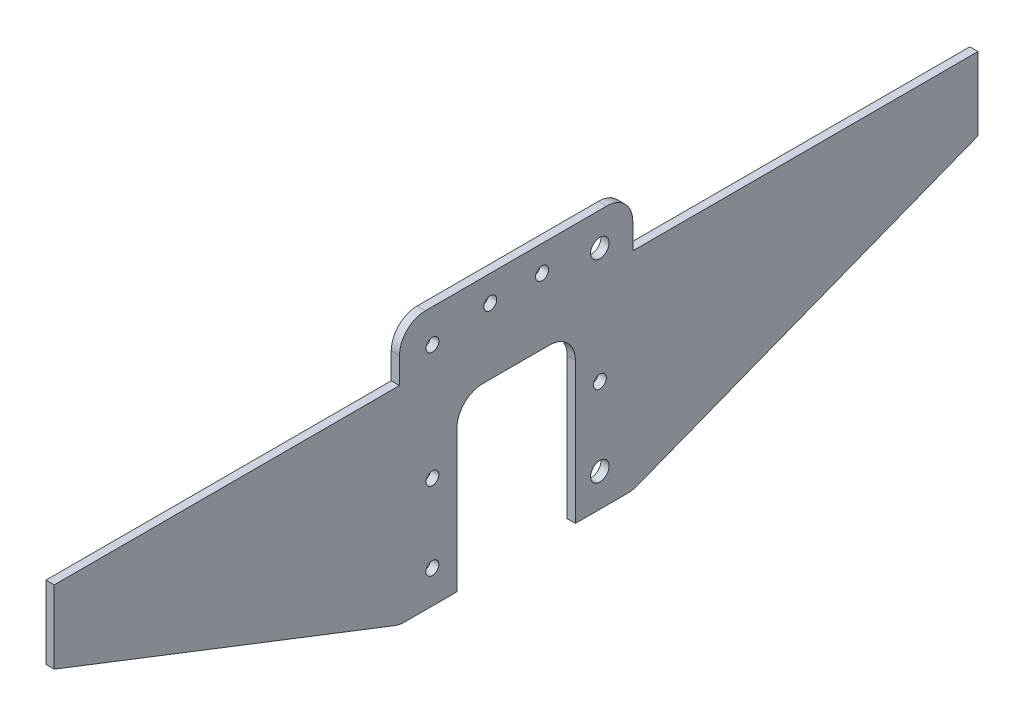
ISO-10303-21;
HEADER;
FILE_DESCRIPTION(('STEP AP214'),'2;1');
FILE_NAME('part.step','',(''),(''),'','','');
FILE_SCHEMA(('AUTOMOTIVE_DESIGN { 1 0 10303 214 1 1 1 1 }'));
ENDSEC;
DATA;
#1=APPLICATION_CONTEXT('core data for automotive mechanical design processes');
#2=APPLICATION_PROTOCOL_DEFINITION('international standard','automotive_design',2000,#1);
#3=PRODUCT_CONTEXT('',#1,'mechanical');
#4=PRODUCT('Part','Part','',(#3));
#5=PRODUCT_RELATED_PRODUCT_CATEGORY('part','',(#4));
#6=PRODUCT_DEFINITION_FORMATION('','',#4);
#7=PRODUCT_DEFINITION_CONTEXT('part definition',#1,'design');
#8=PRODUCT_DEFINITION('design','',#6,#7);
#9=PRODUCT_DEFINITION_SHAPE('','',#8);
#10=(LENGTH_UNIT() NAMED_UNIT(*) SI_UNIT(.MILLI.,.METRE.));
#11=(NAMED_UNIT(*) PLANE_ANGLE_UNIT() SI_UNIT($,.RADIAN.));
#12=(NAMED_UNIT(*) SI_UNIT($,.STERADIAN.) SOLID_ANGLE_UNIT());
#13=UNCERTAINTY_MEASURE_WITH_UNIT(LENGTH_MEASURE(1.E-05),#10,'distance_accuracy_value','');
#14=(GEOMETRIC_REPRESENTATION_CONTEXT(3) GLOBAL_UNCERTAINTY_ASSIGNED_CONTEXT((#13)) GLOBAL_UNIT_ASSIGNED_CONTEXT((#10,
#11,#12)) REPRESENTATION_CONTEXT('',''));
#15=CARTESIAN_POINT('',(0.,0.,0.));
#16=DIRECTION('',(0.,0.,1.));
#17=DIRECTION('',(1.,0.,0.));
#18=AXIS2_PLACEMENT_3D('',#15,#16,#17);
#19=CARTESIAN_POINT('',(-175.,-79.1740510019869,178.18));
#20=DIRECTION('',(1.,0.,0.));
#21=DIRECTION('',(0.,0.,-1.));
#22=AXIS2_PLACEMENT_3D('',#19,#20,#21);
#23=PLANE('',#22);
#24=DIRECTION('',(0.,0.,-1.));
#25=VECTOR('',#24,1.);
#26=CARTESIAN_POINT('',(-175.,25.,-175.));
#27=LINE('',#26,#25);
#28=CARTESIAN_POINT('',(-175.,25.,178.18));
#29=VERTEX_POINT('',#28);
#30=CARTESIAN_POINT('',(-175.,25.,45.));
#31=VERTEX_POINT('',#30);
#32=EDGE_CURVE('E190',#29,#31,#27,.T.);
#33=ORIENTED_EDGE('',*,*,#32,.F.);
#34=DIRECTION('',(0.,1.,0.));
#35=VECTOR('',#34,1.);
#36=CARTESIAN_POINT('',(-175.,-3.18,178.18));
#37=LINE('',#36,#35);
#38=CARTESIAN_POINT('',(-175.,-3.18,178.18));
#39=VERTEX_POINT('',#38);
#40=EDGE_CURVE('E200',#39,#29,#37,.T.);
#41=ORIENTED_EDGE('',*,*,#40,.F.);
#42=DIRECTION('',(0.,0.362615097854079,0.931938995218183));
#43=VECTOR('',#42,1.);
#44=CARTESIAN_POINT('',(-175.,-55.,45.));
#45=LINE('',#44,#43);
#46=CARTESIAN_POINT('',(-175.,-54.3193899521818,46.7492019716022));
#47=VERTEX_POINT('',#46);
#48=EDGE_CURVE('E242',#47,#39,#45,.T.);
#49=ORIENTED_EDGE('',*,*,#48,.F.);
#50=CARTESIAN_POINT('',(-175.,-45.,43.1230509930614));
#51=DIRECTION('',(-1.,0.,0.));
#52=DIRECTION('',(0.,0.,1.));
#53=AXIS2_PLACEMENT_3D('',#50,#51,#52);
#54=CIRCLE('',#53,10.);
#55=CARTESIAN_POINT('',(-175.,-55.,43.1230509930613));
#56=VERTEX_POINT('',#55);
#57=EDGE_CURVE('E345',#47,#56,#54,.F.);
#58=ORIENTED_EDGE('',*,*,#57,.T.);
#59=DIRECTION('',(0.,0.,1.));
#60=VECTOR('',#59,1.);
#61=CARTESIAN_POINT('',(-175.,-55.,-45.));
#62=LINE('',#61,#60);
#63=CARTESIAN_POINT('',(-175.,-55.,22.8599999999999));
#64=VERTEX_POINT('',#63);
#65=EDGE_CURVE('E248',#64,#56,#62,.T.);
#66=ORIENTED_EDGE('',*,*,#65,.F.);
#67=DIRECTION('',(0.,-1.,0.));
#68=VECTOR('',#67,1.);
#69=CARTESIAN_POINT('',(-175.,-0.418994831702844,22.86));
#70=LINE('',#69,#68);
#71=CARTESIAN_POINT('',(-175.,-0.418994831702844,22.86));
#72=VERTEX_POINT('',#71);
#73=EDGE_CURVE('E273',#72,#64,#70,.T.);
#74=ORIENTED_EDGE('',*,*,#73,.F.);
#75=CARTESIAN_POINT('',(-175.,-0.418994831702844,12.86));
#76=DIRECTION('',(-1.,0.,0.));
#77=DIRECTION('',(0.,0.,1.));
#78=AXIS2_PLACEMENT_3D('',#75,#76,#77);
#79=CIRCLE('',#78,10.);
#80=CARTESIAN_POINT('',(-175.,9.58100516829716,12.86));
#81=VERTEX_POINT('',#80);
#82=EDGE_CURVE('E282',#81,#72,#79,.F.);
#83=ORIENTED_EDGE('',*,*,#82,.F.);
#84=DIRECTION('',(0.,0.,1.));
#85=VECTOR('',#84,1.);
#86=CARTESIAN_POINT('',(-175.,9.58100516829716,-12.86));
#87=LINE('',#86,#85);
#88=CARTESIAN_POINT('',(-175.,9.58100516829716,-12.86));
#89=VERTEX_POINT('',#88);
#90=EDGE_CURVE('E293',#89,#81,#87,.T.);
#91=ORIENTED_EDGE('',*,*,#90,.F.);
#92=CARTESIAN_POINT('',(-175.,-0.418994831702843,-12.86));
#93=DIRECTION('',(-1.,0.,0.));
#94=DIRECTION('',(0.,0.,1.));
#95=AXIS2_PLACEMENT_3D('',#92,#93,#94);
#96=CIRCLE('',#95,10.);
#97=CARTESIAN_POINT('',(-175.,-0.418994831702844,-22.86));
#98=VERTEX_POINT('',#97);
#99=EDGE_CURVE('E295',#98,#89,#96,.F.);
#100=ORIENTED_EDGE('',*,*,#99,.F.);
#101=DIRECTION('',(0.,1.,0.));
#102=VECTOR('',#101,1.);
#103=CARTESIAN_POINT('',(-175.,-55.9308657440665,-22.86));
#104=LINE('',#103,#102);
#105=CARTESIAN_POINT('',(-175.,-55.,-22.86));
#106=VERTEX_POINT('',#105);
#107=EDGE_CURVE('E302',#106,#98,#104,.T.);
#108=ORIENTED_EDGE('',*,*,#107,.F.);
#109=CARTESIAN_POINT('',(-175.,-55.,-43.1230509930613));
#110=VERTEX_POINT('',#109);
#111=EDGE_CURVE('E245',#110,#106,#62,.T.);
#112=ORIENTED_EDGE('',*,*,#111,.F.);
#113=CARTESIAN_POINT('',(-175.,-45.,-43.1230509930613));
#114=DIRECTION('',(-1.,0.,0.));
#115=DIRECTION('',(0.,0.,1.));
#116=AXIS2_PLACEMENT_3D('',#113,#114,#115);
#117=CIRCLE('',#116,10.);
#118=CARTESIAN_POINT('',(-175.,-54.3193899521818,-46.7492019716021));
#119=VERTEX_POINT('',#118);
#120=EDGE_CURVE('E343',#110,#119,#117,.F.);
#121=ORIENTED_EDGE('',*,*,#120,.T.);
#122=DIRECTION('',(0.,-0.362615097854079,0.931938995218183));
#123=VECTOR('',#122,1.);
#124=CARTESIAN_POINT('',(-175.,-3.18,-178.18));
#125=LINE('',#124,#123);
#126=CARTESIAN_POINT('',(-175.,-3.18,-178.18));
#127=VERTEX_POINT('',#126);
#128=EDGE_CURVE('E196',#127,#119,#125,.T.);
#129=ORIENTED_EDGE('',*,*,#128,.F.);
#130=DIRECTION('',(0.,-1.,0.));
#131=VECTOR('',#130,1.);
#132=CARTESIAN_POINT('',(-175.,-3.18,-178.18));
#133=LINE('',#132,#131);
#134=CARTESIAN_POINT('',(-175.,25.,-178.18));
#135=VERTEX_POINT('',#134);
#136=EDGE_CURVE('E193',#135,#127,#133,.T.);
#137=ORIENTED_EDGE('',*,*,#136,.F.);
#138=CARTESIAN_POINT('',(-175.,25.,-45.));
#139=VERTEX_POINT('',#138);
#140=EDGE_CURVE('E179',#139,#135,#27,.T.);
#141=ORIENTED_EDGE('',*,*,#140,.F.);
#142=DIRECTION('',(0.,-1.,0.));
#143=VECTOR('',#142,1.);
#144=CARTESIAN_POINT('',(-175.,-3.17999999999998,-45.));
#145=LINE('',#144,#143);
#146=CARTESIAN_POINT('',(-175.,35.,-45.));
#147=VERTEX_POINT('',#146);
#148=EDGE_CURVE('E216',#147,#139,#145,.T.);
#149=ORIENTED_EDGE('',*,*,#148,.F.);
#150=CARTESIAN_POINT('',(-175.,35.,-35.));
#151=DIRECTION('',(-1.,0.,0.));
#152=DIRECTION('',(0.,0.,1.));
#153=AXIS2_PLACEMENT_3D('',#150,#151,#152);
#154=CIRCLE('',#153,10.);
#155=CARTESIAN_POINT('',(-175.,45.,-35.));
#156=VERTEX_POINT('',#155);
#157=EDGE_CURVE('E359',#147,#156,#154,.F.);
#158=ORIENTED_EDGE('',*,*,#157,.T.);
#159=DIRECTION('',(0.,0.,-1.));
#160=VECTOR('',#159,1.);
#161=CARTESIAN_POINT('',(-175.,45.,-45.));
#162=LINE('',#161,#160);
#163=CARTESIAN_POINT('',(-175.,45.,35.));
#164=VERTEX_POINT('',#163);
#165=EDGE_CURVE('E236',#164,#156,#162,.T.);
#166=ORIENTED_EDGE('',*,*,#165,.F.);
#167=CARTESIAN_POINT('',(-175.,35.,35.));
#168=DIRECTION('',(-1.,0.,0.));
#169=DIRECTION('',(0.,0.,1.));
#170=AXIS2_PLACEMENT_3D('',#167,#168,#169);
#171=CIRCLE('',#170,10.);
#172=CARTESIAN_POINT('',(-175.,35.,45.));
#173=VERTEX_POINT('',#172);
#174=EDGE_CURVE('E361',#164,#173,#171,.F.);
#175=ORIENTED_EDGE('',*,*,#174,.T.);
#176=DIRECTION('',(0.,1.,0.));
#177=VECTOR('',#176,1.);
#178=CARTESIAN_POINT('',(-175.,45.,45.));
#179=LINE('',#178,#177);
#180=EDGE_CURVE('E239',#31,#173,#179,.T.);
#181=ORIENTED_EDGE('',*,*,#180,.F.);
#182=EDGE_LOOP('',(#33,#41,#49,#58,#66,#74,#83,#91,#100,#108,#112,#121,#129,#137,#141,#149,#158,
#166,#175,#181));
#183=FACE_BOUND('',#182,.T.);
#184=CARTESIAN_POINT('',(-175.,-42.3,-32.3));
#185=DIRECTION('',(-1.,0.,0.));
#186=DIRECTION('',(0.,0.,1.));
#187=AXIS2_PLACEMENT_3D('',#184,#185,#186);
#188=CIRCLE('',#187,3.57);
#189=CARTESIAN_POINT('',(-175.,-42.3,-28.73));
#190=VERTEX_POINT('',#189);
#191=EDGE_CURVE('E253',#190,#190,#188,.T.);
#192=ORIENTED_EDGE('',*,*,#191,.T.);
#193=EDGE_LOOP('',(#192));
#194=FACE_BOUND('',#193,.T.);
#195=CARTESIAN_POINT('',(-175.,-12.3,-32.3));
#196=DIRECTION('',(-1.,0.,0.));
#197=DIRECTION('',(0.,0.,1.));
#198=AXIS2_PLACEMENT_3D('',#195,#196,#197);
#199=CIRCLE('',#198,2.5);
#200=CARTESIAN_POINT('',(-175.,-12.3,-29.8));
#201=VERTEX_POINT('',#200);
#202=EDGE_CURVE('E269',#201,#201,#199,.T.);
#203=ORIENTED_EDGE('',*,*,#202,.T.);
#204=EDGE_LOOP('',(#203));
#205=FACE_BOUND('',#204,.T.);
#206=CARTESIAN_POINT('',(-175.,35.,10.00000000008));
#207=DIRECTION('',(-1.,0.,0.));
#208=DIRECTION('',(0.,0.,1.));
#209=AXIS2_PLACEMENT_3D('',#206,#207,#208);
#210=CIRCLE('',#209,2.50000000000005);
#211=CARTESIAN_POINT('',(-175.,35.,12.5000000000801));
#212=VERTEX_POINT('',#211);
#213=EDGE_CURVE('E45',#212,#212,#210,.T.);
#214=ORIENTED_EDGE('',*,*,#213,.T.);
#215=EDGE_LOOP('',(#214));
#216=FACE_BOUND('',#215,.T.);
#217=CARTESIAN_POINT('',(-175.,35.,-9.99999999992));
#218=DIRECTION('',(-1.,0.,0.));
#219=DIRECTION('',(0.,0.,1.));
#220=AXIS2_PLACEMENT_3D('',#217,#218,#219);
#221=CIRCLE('',#220,2.50000000000005);
#222=CARTESIAN_POINT('',(-175.,35.,-7.49999999991995));
#223=VERTEX_POINT('',#222);
#224=EDGE_CURVE('E292',#223,#223,#221,.T.);
#225=ORIENTED_EDGE('',*,*,#224,.T.);
#226=EDGE_LOOP('',(#225));
#227=FACE_BOUND('',#226,.T.);
#228=CARTESIAN_POINT('',(-175.,32.3,32.3));
#229=DIRECTION('',(-1.,0.,0.));
#230=DIRECTION('',(0.,0.,1.));
#231=AXIS2_PLACEMENT_3D('',#228,#229,#230);
#232=CIRCLE('',#231,2.5);
#233=CARTESIAN_POINT('',(-175.,32.3,34.8));
#234=VERTEX_POINT('',#233);
#235=EDGE_CURVE('E257',#234,#234,#232,.T.);
#236=ORIENTED_EDGE('',*,*,#235,.T.);
#237=EDGE_LOOP('',(#236));
#238=FACE_BOUND('',#237,.T.);
#239=CARTESIAN_POINT('',(-175.,32.3,-32.3));
#240=DIRECTION('',(-1.,0.,0.));
#241=DIRECTION('',(0.,0.,1.));
#242=AXIS2_PLACEMENT_3D('',#239,#240,#241);
#243=CIRCLE('',#242,3.57);
#244=CARTESIAN_POINT('',(-175.,32.3,-28.73));
#245=VERTEX_POINT('',#244);
#246=EDGE_CURVE('E234',#245,#245,#243,.T.);
#247=ORIENTED_EDGE('',*,*,#246,.T.);
#248=EDGE_LOOP('',(#247));
#249=FACE_BOUND('',#248,.T.);
#250=CARTESIAN_POINT('',(-175.,-12.3,32.3));
#251=DIRECTION('',(-1.,0.,0.));
#252=DIRECTION('',(0.,0.,1.));
#253=AXIS2_PLACEMENT_3D('',#250,#251,#252);
#254=CIRCLE('',#253,2.5);
#255=CARTESIAN_POINT('',(-175.,-12.3,34.8));
#256=VERTEX_POINT('',#255);
#257=EDGE_CURVE('E265',#256,#256,#254,.T.);
#258=ORIENTED_EDGE('',*,*,#257,.T.);
#259=EDGE_LOOP('',(#258));
#260=FACE_BOUND('',#259,.T.);
#261=CARTESIAN_POINT('',(-175.,-42.3,32.3));
#262=DIRECTION('',(-1.,0.,0.));
#263=DIRECTION('',(0.,0.,1.));
#264=AXIS2_PLACEMENT_3D('',#261,#262,#263);
#265=CIRCLE('',#264,2.5);
#266=CARTESIAN_POINT('',(-175.,-42.3,34.8));
#267=VERTEX_POINT('',#266);
#268=EDGE_CURVE('E261',#267,#267,#265,.T.);
#269=ORIENTED_EDGE('',*,*,#268,.T.);
#270=EDGE_LOOP('',(#269));
#271=FACE_BOUND('',#270,.T.);
#272=ADVANCED_FACE('F36',(#183,#194,#205,#216,#227,#238,#249,#260,#271),#23,.T.);
#273=CARTESIAN_POINT('',(0.,25.,0.));
#274=DIRECTION('',(0.,1.,0.));
#275=DIRECTION('',(0.,0.,1.));
#276=AXIS2_PLACEMENT_3D('',#273,#274,#275);
#277=PLANE('',#276);
#278=DIRECTION('',(-1.,0.,0.));
#279=VECTOR('',#278,1.);
#280=CARTESIAN_POINT('',(175.,25.,178.18));
#281=LINE('',#280,#279);
#282=CARTESIAN_POINT('',(-178.18,25.,178.18));
#283=VERTEX_POINT('',#282);
#284=EDGE_CURVE('E210',#29,#283,#281,.T.);
#285=ORIENTED_EDGE('',*,*,#284,.F.);
#286=ORIENTED_EDGE('',*,*,#32,.T.);
#287=DIRECTION('',(1.,0.,0.));
#288=VECTOR('',#287,1.);
#289=CARTESIAN_POINT('',(0.,25.,45.));
#290=LINE('',#289,#288);
#291=CARTESIAN_POINT('',(-178.18,25.,45.));
#292=VERTEX_POINT('',#291);
#293=EDGE_CURVE('E320',#292,#31,#290,.T.);
#294=ORIENTED_EDGE('',*,*,#293,.F.);
#295=DIRECTION('',(0.,0.,-1.));
#296=VECTOR('',#295,1.);
#297=CARTESIAN_POINT('',(-178.18,25.,-175.));
#298=LINE('',#297,#296);
#299=EDGE_CURVE('E206',#283,#292,#298,.T.);
#300=ORIENTED_EDGE('',*,*,#299,.F.);
#301=EDGE_LOOP('',(#285,#286,#294,#300));
#302=FACE_BOUND('',#301,.T.);
#303=ADVANCED_FACE('F319',(#302),#277,.T.);
#304=ORIENTED_EDGE('',*,*,#140,.T.);
#305=DIRECTION('',(1.,0.,0.));
#306=VECTOR('',#305,1.);
#307=CARTESIAN_POINT('',(175.,25.,-178.18));
#308=LINE('',#307,#306);
#309=CARTESIAN_POINT('',(-178.18,25.,-178.18));
#310=VERTEX_POINT('',#309);
#311=EDGE_CURVE('E40',#310,#135,#308,.T.);
#312=ORIENTED_EDGE('',*,*,#311,.F.);
#313=CARTESIAN_POINT('',(-178.18,25.,-45.));
#314=VERTEX_POINT('',#313);
#315=EDGE_CURVE('E204',#314,#310,#298,.T.);
#316=ORIENTED_EDGE('',*,*,#315,.F.);
#317=DIRECTION('',(-1.,0.,0.));
#318=VECTOR('',#317,1.);
#319=CARTESIAN_POINT('',(0.,25.,-45.));
#320=LINE('',#319,#318);
#321=EDGE_CURVE('E186',#139,#314,#320,.T.);
#322=ORIENTED_EDGE('',*,*,#321,.F.);
#323=EDGE_LOOP('',(#304,#312,#316,#322));
#324=FACE_BOUND('',#323,.T.);
#325=ADVANCED_FACE('F181',(#324),#277,.T.);
#326=CARTESIAN_POINT('',(175.,-3.18,178.18));
#327=DIRECTION('',(0.,0.,1.));
#328=DIRECTION('',(-1.,0.,0.));
#329=AXIS2_PLACEMENT_3D('',#326,#327,#328);
#330=PLANE('',#329);
#331=DIRECTION('',(-1.,0.,0.));
#332=VECTOR('',#331,1.);
#333=CARTESIAN_POINT('',(-175.,-3.18,178.18));
#334=LINE('',#333,#332);
#335=CARTESIAN_POINT('',(-178.18,-3.18,178.18));
#336=VERTEX_POINT('',#335);
#337=EDGE_CURVE('E189',#39,#336,#334,.T.);
#338=ORIENTED_EDGE('',*,*,#337,.F.);
#339=ORIENTED_EDGE('',*,*,#40,.T.);
#340=ORIENTED_EDGE('',*,*,#284,.T.);
#341=DIRECTION('',(0.,1.,0.));
#342=VECTOR('',#341,1.);
#343=CARTESIAN_POINT('',(-178.18,-3.18,178.18));
#344=LINE('',#343,#342);
#345=EDGE_CURVE('E310',#336,#283,#344,.T.);
#346=ORIENTED_EDGE('',*,*,#345,.F.);
#347=EDGE_LOOP('',(#338,#339,#340,#346));
#348=FACE_BOUND('',#347,.T.);
#349=ADVANCED_FACE('F38',(#348),#330,.T.);
#350=CARTESIAN_POINT('',(175.,-3.18,-178.18));
#351=DIRECTION('',(0.,0.,-1.));
#352=DIRECTION('',(1.,0.,0.));
#353=AXIS2_PLACEMENT_3D('',#350,#351,#352);
#354=PLANE('',#353);
#355=ORIENTED_EDGE('',*,*,#311,.T.);
#356=ORIENTED_EDGE('',*,*,#136,.T.);
#357=DIRECTION('',(1.,0.,0.));
#358=VECTOR('',#357,1.);
#359=CARTESIAN_POINT('',(175.,-3.18,-178.18));
#360=LINE('',#359,#358);
#361=CARTESIAN_POINT('',(-178.18,-3.18,-178.18));
#362=VERTEX_POINT('',#361);
#363=EDGE_CURVE('E309',#362,#127,#360,.T.);
#364=ORIENTED_EDGE('',*,*,#363,.F.);
#365=DIRECTION('',(0.,1.,0.));
#366=VECTOR('',#365,1.);
#367=CARTESIAN_POINT('',(-178.18,-3.18,-178.18));
#368=LINE('',#367,#366);
#369=EDGE_CURVE('E203',#362,#310,#368,.T.);
#370=ORIENTED_EDGE('',*,*,#369,.T.);
#371=EDGE_LOOP('',(#355,#356,#364,#370));
#372=FACE_BOUND('',#371,.T.);
#373=ADVANCED_FACE('F202',(#372),#354,.T.);
#374=CARTESIAN_POINT('',(-175.,-3.18,-178.18));
#375=DIRECTION('',(0.,-0.931938995218183,-0.362615097854079));
#376=DIRECTION('',(0.,0.362615097854079,-0.931938995218183));
#377=AXIS2_PLACEMENT_3D('',#374,#375,#376);
#378=PLANE('',#377);
#379=ORIENTED_EDGE('',*,*,#128,.T.);
#380=DIRECTION('',(-1.,0.,0.));
#381=VECTOR('',#380,1.);
#382=CARTESIAN_POINT('',(-175.,-54.3193899521818,-46.7492019716021));
#383=LINE('',#382,#381);
#384=CARTESIAN_POINT('',(-178.18,-54.3193899521818,-46.7492019716021));
#385=VERTEX_POINT('',#384);
#386=EDGE_CURVE('E348',#119,#385,#383,.T.);
#387=ORIENTED_EDGE('',*,*,#386,.T.);
#388=DIRECTION('',(0.,-0.362615097854079,0.931938995218183));
#389=VECTOR('',#388,1.);
#390=CARTESIAN_POINT('',(-178.18,-3.18,-178.18));
#391=LINE('',#390,#389);
#392=EDGE_CURVE('E231',#362,#385,#391,.T.);
#393=ORIENTED_EDGE('',*,*,#392,.F.);
#394=ORIENTED_EDGE('',*,*,#363,.T.);
#395=EDGE_LOOP('',(#379,#387,#393,#394));
#396=FACE_BOUND('',#395,.T.);
#397=ADVANCED_FACE('F412',(#396),#378,.T.);
#398=CARTESIAN_POINT('',(-175.,45.,45.));
#399=DIRECTION('',(0.,0.,1.));
#400=DIRECTION('',(1.,0.,0.));
#401=AXIS2_PLACEMENT_3D('',#398,#399,#400);
#402=PLANE('',#401);
#403=ORIENTED_EDGE('',*,*,#180,.T.);
#404=DIRECTION('',(-1.,0.,0.));
#405=VECTOR('',#404,1.);
#406=CARTESIAN_POINT('',(-175.,35.,45.));
#407=LINE('',#406,#405);
#408=CARTESIAN_POINT('',(-178.18,35.,45.));
#409=VERTEX_POINT('',#408);
#410=EDGE_CURVE('E351',#173,#409,#407,.T.);
#411=ORIENTED_EDGE('',*,*,#410,.T.);
#412=DIRECTION('',(0.,1.,0.));
#413=VECTOR('',#412,1.);
#414=CARTESIAN_POINT('',(-178.18,45.,45.));
#415=LINE('',#414,#413);
#416=EDGE_CURVE('E222',#292,#409,#415,.T.);
#417=ORIENTED_EDGE('',*,*,#416,.F.);
#418=ORIENTED_EDGE('',*,*,#293,.T.);
#419=EDGE_LOOP('',(#403,#411,#417,#418));
#420=FACE_BOUND('',#419,.T.);
#421=ADVANCED_FACE('F417',(#420),#402,.T.);
#422=CARTESIAN_POINT('',(-175.,45.,-45.));
#423=DIRECTION('',(0.,1.,0.));
#424=DIRECTION('',(0.,0.,1.));
#425=AXIS2_PLACEMENT_3D('',#422,#423,#424);
#426=PLANE('',#425);
#427=DIRECTION('',(0.,0.,-1.));
#428=VECTOR('',#427,1.);
#429=CARTESIAN_POINT('',(-178.18,45.,-45.));
#430=LINE('',#429,#428);
#431=CARTESIAN_POINT('',(-178.18,45.,35.));
#432=VERTEX_POINT('',#431);
#433=CARTESIAN_POINT('',(-178.18,45.,-35.));
#434=VERTEX_POINT('',#433);
#435=EDGE_CURVE('E219',#432,#434,#430,.T.);
#436=ORIENTED_EDGE('',*,*,#435,.F.);
#437=DIRECTION('',(-1.,0.,0.));
#438=VECTOR('',#437,1.);
#439=CARTESIAN_POINT('',(-175.,45.,35.));
#440=LINE('',#439,#438);
#441=EDGE_CURVE('E357',#432,#164,#440,.F.);
#442=ORIENTED_EDGE('',*,*,#441,.T.);
#443=ORIENTED_EDGE('',*,*,#165,.T.);
#444=DIRECTION('',(-1.,0.,0.));
#445=VECTOR('',#444,1.);
#446=CARTESIAN_POINT('',(-175.,45.,-35.));
#447=LINE('',#446,#445);
#448=EDGE_CURVE('E354',#156,#434,#447,.T.);
#449=ORIENTED_EDGE('',*,*,#448,.T.);
#450=EDGE_LOOP('',(#436,#442,#443,#449));
#451=FACE_BOUND('',#450,.T.);
#452=ADVANCED_FACE('F633',(#451),#426,.T.);
#453=CARTESIAN_POINT('',(-175.,-55.,-45.));
#454=DIRECTION('',(0.,-1.,0.));
#455=DIRECTION('',(0.,0.,-1.));
#456=AXIS2_PLACEMENT_3D('',#453,#454,#455);
#457=PLANE('',#456);
#458=DIRECTION('',(1.,0.,0.));
#459=VECTOR('',#458,1.);
#460=CARTESIAN_POINT('',(-175.,-55.,-22.86));
#461=LINE('',#460,#459);
#462=CARTESIAN_POINT('',(-178.18,-55.,-22.86));
#463=VERTEX_POINT('',#462);
#464=EDGE_CURVE('E307',#463,#106,#461,.T.);
#465=ORIENTED_EDGE('',*,*,#464,.F.);
#466=DIRECTION('',(0.,0.,1.));
#467=VECTOR('',#466,1.);
#468=CARTESIAN_POINT('',(-178.18,-55.,-45.));
#469=LINE('',#468,#467);
#470=CARTESIAN_POINT('',(-178.18,-55.,-43.1230509930613));
#471=VERTEX_POINT('',#470);
#472=EDGE_CURVE('E227',#471,#463,#469,.T.);
#473=ORIENTED_EDGE('',*,*,#472,.F.);
#474=DIRECTION('',(-1.,0.,0.));
#475=VECTOR('',#474,1.);
#476=CARTESIAN_POINT('',(-175.,-55.,-43.1230509930613));
#477=LINE('',#476,#475);
#478=EDGE_CURVE('E328',#471,#110,#477,.F.);
#479=ORIENTED_EDGE('',*,*,#478,.T.);
#480=ORIENTED_EDGE('',*,*,#111,.T.);
#481=EDGE_LOOP('',(#465,#473,#479,#480));
#482=FACE_BOUND('',#481,.T.);
#483=ADVANCED_FACE('F575',(#482),#457,.T.);
#484=CARTESIAN_POINT('',(-95.1118054376104,-55.9308657440665,-22.86));
#485=DIRECTION('',(0.,0.,-1.));
#486=DIRECTION('',(0.,1.,0.));
#487=AXIS2_PLACEMENT_3D('',#484,#485,#486);
#488=PLANE('',#487);
#489=ORIENTED_EDGE('',*,*,#464,.T.);
#490=ORIENTED_EDGE('',*,*,#107,.T.);
#491=DIRECTION('',(-1.,0.,0.));
#492=VECTOR('',#491,1.);
#493=CARTESIAN_POINT('',(-95.1118054376104,-0.418994831702844,-22.86));
#494=LINE('',#493,#492);
#495=CARTESIAN_POINT('',(-178.18,-0.418994831702844,-22.86));
#496=VERTEX_POINT('',#495);
#497=EDGE_CURVE('E280',#98,#496,#494,.T.);
#498=ORIENTED_EDGE('',*,*,#497,.T.);
#499=DIRECTION('',(0.,-1.,0.));
#500=VECTOR('',#499,1.);
#501=CARTESIAN_POINT('',(-178.18,-55.9308657440665,-22.86));
#502=LINE('',#501,#500);
#503=EDGE_CURVE('E276',#496,#463,#502,.T.);
#504=ORIENTED_EDGE('',*,*,#503,.T.);
#505=EDGE_LOOP('',(#489,#490,#498,#504));
#506=FACE_BOUND('',#505,.T.);
#507=ADVANCED_FACE('F616',(#506),#488,.F.);
#508=CARTESIAN_POINT('',(-95.1118054376104,-0.418994831702843,-12.86));
#509=DIRECTION('',(-1.,0.,0.));
#510=DIRECTION('',(0.,0.,1.));
#511=AXIS2_PLACEMENT_3D('',#508,#509,#510);
#512=CYLINDRICAL_SURFACE('',#511,10.);
#513=ORIENTED_EDGE('',*,*,#497,.F.);
#514=ORIENTED_EDGE('',*,*,#99,.T.);
#515=DIRECTION('',(-1.,0.,0.));
#516=VECTOR('',#515,1.);
#517=CARTESIAN_POINT('',(-95.1118054376104,9.58100516829716,-12.86));
#518=LINE('',#517,#516);
#519=CARTESIAN_POINT('',(-178.18,9.58100516829716,-12.86));
#520=VERTEX_POINT('',#519);
#521=EDGE_CURVE('E278',#89,#520,#518,.T.);
#522=ORIENTED_EDGE('',*,*,#521,.T.);
#523=CARTESIAN_POINT('',(-178.18,-0.418994831702843,-12.86));
#524=DIRECTION('',(-1.,0.,0.));
#525=DIRECTION('',(0.,0.,1.));
#526=AXIS2_PLACEMENT_3D('',#523,#524,#525);
#527=CIRCLE('',#526,10.);
#528=EDGE_CURVE('E284',#520,#496,#527,.T.);
#529=ORIENTED_EDGE('',*,*,#528,.T.);
#530=EDGE_LOOP('',(#513,#514,#522,#529));
#531=FACE_BOUND('',#530,.T.);
#532=ADVANCED_FACE('F608',(#531),#512,.F.);
#533=CARTESIAN_POINT('',(-95.1118054376104,9.58100516829716,-12.86));
#534=DIRECTION('',(0.,1.,0.));
#535=DIRECTION('',(0.,0.,1.));
#536=AXIS2_PLACEMENT_3D('',#533,#534,#535);
#537=PLANE('',#536);
#538=ORIENTED_EDGE('',*,*,#90,.T.);
#539=DIRECTION('',(-1.,0.,0.));
#540=VECTOR('',#539,1.);
#541=CARTESIAN_POINT('',(-95.1118054376104,9.58100516829716,12.86));
#542=LINE('',#541,#540);
#543=CARTESIAN_POINT('',(-178.18,9.58100516829716,12.86));
#544=VERTEX_POINT('',#543);
#545=EDGE_CURVE('E61',#81,#544,#542,.T.);
#546=ORIENTED_EDGE('',*,*,#545,.T.);
#547=DIRECTION('',(0.,0.,-1.));
#548=VECTOR('',#547,1.);
#549=CARTESIAN_POINT('',(-178.18,9.58100516829716,-12.86));
#550=LINE('',#549,#548);
#551=EDGE_CURVE('E287',#544,#520,#550,.T.);
#552=ORIENTED_EDGE('',*,*,#551,.T.);
#553=ORIENTED_EDGE('',*,*,#521,.F.);
#554=EDGE_LOOP('',(#538,#546,#552,#553));
#555=FACE_BOUND('',#554,.T.);
#556=ADVANCED_FACE('F599',(#555),#537,.F.);
#557=CARTESIAN_POINT('',(-95.1118054376104,-0.418994831702844,12.86));
#558=DIRECTION('',(-1.,0.,0.));
#559=DIRECTION('',(0.,0.,1.));
#560=AXIS2_PLACEMENT_3D('',#557,#558,#559);
#561=CYLINDRICAL_SURFACE('',#560,10.);
#562=ORIENTED_EDGE('',*,*,#545,.F.);
#563=ORIENTED_EDGE('',*,*,#82,.T.);
#564=DIRECTION('',(-1.,0.,0.));
#565=VECTOR('',#564,1.);
#566=CARTESIAN_POINT('',(-95.1118054376104,-0.418994831702844,22.86));
#567=LINE('',#566,#565);
#568=CARTESIAN_POINT('',(-178.18,-0.418994831702844,22.86));
#569=VERTEX_POINT('',#568);
#570=EDGE_CURVE('E274',#72,#569,#567,.T.);
#571=ORIENTED_EDGE('',*,*,#570,.T.);
#572=CARTESIAN_POINT('',(-178.18,-0.418994831702844,12.86));
#573=DIRECTION('',(-1.,0.,0.));
#574=DIRECTION('',(0.,0.,1.));
#575=AXIS2_PLACEMENT_3D('',#572,#573,#574);
#576=CIRCLE('',#575,10.);
#577=EDGE_CURVE('E289',#569,#544,#576,.T.);
#578=ORIENTED_EDGE('',*,*,#577,.T.);
#579=EDGE_LOOP('',(#562,#563,#571,#578));
#580=FACE_BOUND('',#579,.T.);
#581=ADVANCED_FACE('F400',(#580),#561,.F.);
#582=CARTESIAN_POINT('',(-178.18,-3.18,-175.));
#583=DIRECTION('',(-1.,0.,0.));
#584=DIRECTION('',(0.,0.,-1.));
#585=AXIS2_PLACEMENT_3D('',#582,#583,#584);
#586=PLANE('',#585);
#587=CARTESIAN_POINT('',(-178.18,35.,10.00000000008));
#588=DIRECTION('',(-1.,0.,0.));
#589=DIRECTION('',(0.,0.,1.));
#590=AXIS2_PLACEMENT_3D('',#587,#588,#589);
#591=CIRCLE('',#590,2.50000000000005);
#592=CARTESIAN_POINT('',(-178.18,35.,12.5000000000801));
#593=VERTEX_POINT('',#592);
#594=EDGE_CURVE('E11',#593,#593,#591,.T.);
#595=ORIENTED_EDGE('',*,*,#594,.F.);
#596=EDGE_LOOP('',(#595));
#597=FACE_BOUND('',#596,.T.);
#598=CARTESIAN_POINT('',(-178.18,35.,-9.99999999992));
#599=DIRECTION('',(-1.,0.,0.));
#600=DIRECTION('',(0.,0.,1.));
#601=AXIS2_PLACEMENT_3D('',#598,#599,#600);
#602=CIRCLE('',#601,2.50000000000005);
#603=CARTESIAN_POINT('',(-178.18,35.,-7.49999999991995));
#604=VERTEX_POINT('',#603);
#605=EDGE_CURVE('E296',#604,#604,#602,.T.);
#606=ORIENTED_EDGE('',*,*,#605,.F.);
#607=EDGE_LOOP('',(#606));
#608=FACE_BOUND('',#607,.T.);
#609=ORIENTED_EDGE('',*,*,#503,.F.);
#610=ORIENTED_EDGE('',*,*,#528,.F.);
#611=ORIENTED_EDGE('',*,*,#551,.F.);
#612=ORIENTED_EDGE('',*,*,#577,.F.);
#613=DIRECTION('',(0.,1.,0.));
#614=VECTOR('',#613,1.);
#615=CARTESIAN_POINT('',(-178.18,-0.418994831702844,22.86));
#616=LINE('',#615,#614);
#617=CARTESIAN_POINT('',(-178.18,-55.,22.86));
#618=VERTEX_POINT('',#617);
#619=EDGE_CURVE('E53',#618,#569,#616,.T.);
#620=ORIENTED_EDGE('',*,*,#619,.F.);
#621=CARTESIAN_POINT('',(-178.18,-55.,43.1230509930613));
#622=VERTEX_POINT('',#621);
#623=EDGE_CURVE('E230',#618,#622,#469,.T.);
#624=ORIENTED_EDGE('',*,*,#623,.T.);
#625=CARTESIAN_POINT('',(-178.18,-45.,43.1230509930614));
#626=DIRECTION('',(-1.,0.,0.));
#627=DIRECTION('',(0.,0.,1.));
#628=AXIS2_PLACEMENT_3D('',#625,#626,#627);
#629=CIRCLE('',#628,10.);
#630=CARTESIAN_POINT('',(-178.18,-54.3193899521818,46.7492019716022));
#631=VERTEX_POINT('',#630);
#632=EDGE_CURVE('E339',#622,#631,#629,.T.);
#633=ORIENTED_EDGE('',*,*,#632,.T.);
#634=DIRECTION('',(0.,0.362615097854079,0.931938995218183));
#635=VECTOR('',#634,1.);
#636=CARTESIAN_POINT('',(-178.18,-55.,45.));
#637=LINE('',#636,#635);
#638=EDGE_CURVE('E225',#631,#336,#637,.T.);
#639=ORIENTED_EDGE('',*,*,#638,.T.);
#640=ORIENTED_EDGE('',*,*,#345,.T.);
#641=ORIENTED_EDGE('',*,*,#299,.T.);
#642=ORIENTED_EDGE('',*,*,#416,.T.);
#643=CARTESIAN_POINT('',(-178.18,35.,35.));
#644=DIRECTION('',(-1.,0.,0.));
#645=DIRECTION('',(0.,0.,1.));
#646=AXIS2_PLACEMENT_3D('',#643,#644,#645);
#647=CIRCLE('',#646,10.);
#648=EDGE_CURVE('E335',#409,#432,#647,.T.);
#649=ORIENTED_EDGE('',*,*,#648,.T.);
#650=ORIENTED_EDGE('',*,*,#435,.T.);
#651=CARTESIAN_POINT('',(-178.18,35.,-35.));
#652=DIRECTION('',(-1.,0.,0.));
#653=DIRECTION('',(0.,0.,1.));
#654=AXIS2_PLACEMENT_3D('',#651,#652,#653);
#655=CIRCLE('',#654,10.);
#656=CARTESIAN_POINT('',(-178.18,35.,-45.));
#657=VERTEX_POINT('',#656);
#658=EDGE_CURVE('E333',#434,#657,#655,.T.);
#659=ORIENTED_EDGE('',*,*,#658,.T.);
#660=DIRECTION('',(0.,-1.,0.));
#661=VECTOR('',#660,1.);
#662=CARTESIAN_POINT('',(-178.18,-3.17999999999998,-45.));
#663=LINE('',#662,#661);
#664=EDGE_CURVE('E217',#657,#314,#663,.T.);
#665=ORIENTED_EDGE('',*,*,#664,.T.);
#666=ORIENTED_EDGE('',*,*,#315,.T.);
#667=ORIENTED_EDGE('',*,*,#369,.F.);
#668=ORIENTED_EDGE('',*,*,#392,.T.);
#669=CARTESIAN_POINT('',(-178.18,-45.,-43.1230509930613));
#670=DIRECTION('',(-1.,0.,0.));
#671=DIRECTION('',(0.,0.,1.));
#672=AXIS2_PLACEMENT_3D('',#669,#670,#671);
#673=CIRCLE('',#672,10.);
#674=EDGE_CURVE('E337',#385,#471,#673,.T.);
#675=ORIENTED_EDGE('',*,*,#674,.T.);
#676=ORIENTED_EDGE('',*,*,#472,.T.);
#677=EDGE_LOOP('',(#609,#610,#611,#612,#620,#624,#633,#639,#640,#641,#642,#649,#650,#659,#665,
#666,#667,#668,#675,#676));
#678=FACE_BOUND('',#677,.T.);
#679=CARTESIAN_POINT('',(-178.18,-12.3,-32.3));
#680=DIRECTION('',(1.,0.,0.));
#681=DIRECTION('',(0.,0.,-1.));
#682=AXIS2_PLACEMENT_3D('',#679,#680,#681);
#683=CIRCLE('',#682,2.5);
#684=CARTESIAN_POINT('',(-178.18,-12.3,-34.8));
#685=VERTEX_POINT('',#684);
#686=EDGE_CURVE('E270',#685,#685,#683,.T.);
#687=ORIENTED_EDGE('',*,*,#686,.T.);
#688=EDGE_LOOP('',(#687));
#689=FACE_BOUND('',#688,.T.);
#690=CARTESIAN_POINT('',(-178.18,-12.3,32.3));
#691=DIRECTION('',(1.,0.,0.));
#692=DIRECTION('',(0.,0.,-1.));
#693=AXIS2_PLACEMENT_3D('',#690,#691,#692);
#694=CIRCLE('',#693,2.5);
#695=CARTESIAN_POINT('',(-178.18,-12.3,29.8));
#696=VERTEX_POINT('',#695);
#697=EDGE_CURVE('E266',#696,#696,#694,.T.);
#698=ORIENTED_EDGE('',*,*,#697,.T.);
#699=EDGE_LOOP('',(#698));
#700=FACE_BOUND('',#699,.T.);
#701=CARTESIAN_POINT('',(-178.18,-42.3,32.3));
#702=DIRECTION('',(-1.,0.,0.));
#703=DIRECTION('',(0.,0.,1.));
#704=AXIS2_PLACEMENT_3D('',#701,#702,#703);
#705=CIRCLE('',#704,2.5);
#706=CARTESIAN_POINT('',(-178.18,-42.3,34.8));
#707=VERTEX_POINT('',#706);
#708=EDGE_CURVE('E262',#707,#707,#705,.T.);
#709=ORIENTED_EDGE('',*,*,#708,.F.);
#710=EDGE_LOOP('',(#709));
#711=FACE_BOUND('',#710,.T.);
#712=CARTESIAN_POINT('',(-178.18,32.3,32.3));
#713=DIRECTION('',(-1.,0.,0.));
#714=DIRECTION('',(0.,0.,1.));
#715=AXIS2_PLACEMENT_3D('',#712,#713,#714);
#716=CIRCLE('',#715,2.5);
#717=CARTESIAN_POINT('',(-178.18,32.3,34.8));
#718=VERTEX_POINT('',#717);
#719=EDGE_CURVE('E258',#718,#718,#716,.T.);
#720=ORIENTED_EDGE('',*,*,#719,.F.);
#721=EDGE_LOOP('',(#720));
#722=FACE_BOUND('',#721,.T.);
#723=CARTESIAN_POINT('',(-178.18,-42.3,-32.3));
#724=DIRECTION('',(-1.,0.,0.));
#725=DIRECTION('',(0.,0.,1.));
#726=AXIS2_PLACEMENT_3D('',#723,#724,#725);
#727=CIRCLE('',#726,3.57);
#728=CARTESIAN_POINT('',(-178.18,-42.3,-28.73));
#729=VERTEX_POINT('',#728);
#730=EDGE_CURVE('E254',#729,#729,#727,.T.);
#731=ORIENTED_EDGE('',*,*,#730,.F.);
#732=EDGE_LOOP('',(#731));
#733=FACE_BOUND('',#732,.T.);
#734=CARTESIAN_POINT('',(-178.18,32.3,-32.3));
#735=DIRECTION('',(-1.,0.,0.));
#736=DIRECTION('',(0.,0.,1.));
#737=AXIS2_PLACEMENT_3D('',#734,#735,#736);
#738=CIRCLE('',#737,3.57);
#739=CARTESIAN_POINT('',(-178.18,32.3,-28.73));
#740=VERTEX_POINT('',#739);
#741=EDGE_CURVE('E250',#740,#740,#738,.T.);
#742=ORIENTED_EDGE('',*,*,#741,.F.);
#743=EDGE_LOOP('',(#742));
#744=FACE_BOUND('',#743,.T.);
#745=ADVANCED_FACE('F322',(#597,#608,#678,#689,#700,#711,#722,#733,#744),#586,.T.);
#746=CARTESIAN_POINT('',(178.18,35.,10.00000000008));
#747=DIRECTION('',(-1.,0.,0.));
#748=DIRECTION('',(0.,0.,1.));
#749=AXIS2_PLACEMENT_3D('',#746,#747,#748);
#750=CYLINDRICAL_SURFACE('',#749,2.50000000000005);
#751=ORIENTED_EDGE('',*,*,#594,.T.);
#752=EDGE_LOOP('',(#751));
#753=FACE_BOUND('',#752,.T.);
#754=ORIENTED_EDGE('',*,*,#213,.F.);
#755=EDGE_LOOP('',(#754));
#756=FACE_BOUND('',#755,.T.);
#757=ADVANCED_FACE('F388',(#753,#756),#750,.F.);
#758=CARTESIAN_POINT('',(178.18,35.,-9.99999999992));
#759=DIRECTION('',(-1.,0.,0.));
#760=DIRECTION('',(0.,0.,1.));
#761=AXIS2_PLACEMENT_3D('',#758,#759,#760);
#762=CYLINDRICAL_SURFACE('',#761,2.50000000000005);
#763=ORIENTED_EDGE('',*,*,#605,.T.);
#764=EDGE_LOOP('',(#763));
#765=FACE_BOUND('',#764,.T.);
#766=ORIENTED_EDGE('',*,*,#224,.F.);
#767=EDGE_LOOP('',(#766));
#768=FACE_BOUND('',#767,.T.);
#769=ADVANCED_FACE('F390',(#765,#768),#762,.F.);
#770=DIRECTION('',(-1.,0.,0.));
#771=VECTOR('',#770,1.);
#772=CARTESIAN_POINT('',(-175.,-55.,22.86));
#773=LINE('',#772,#771);
#774=EDGE_CURVE('E365',#64,#618,#773,.T.);
#775=ORIENTED_EDGE('',*,*,#774,.F.);
#776=ORIENTED_EDGE('',*,*,#65,.T.);
#777=DIRECTION('',(-1.,0.,0.));
#778=VECTOR('',#777,1.);
#779=CARTESIAN_POINT('',(-175.,-55.,43.1230509930614));
#780=LINE('',#779,#778);
#781=EDGE_CURVE('E330',#56,#622,#780,.T.);
#782=ORIENTED_EDGE('',*,*,#781,.T.);
#783=ORIENTED_EDGE('',*,*,#623,.F.);
#784=EDGE_LOOP('',(#775,#776,#782,#783));
#785=FACE_BOUND('',#784,.T.);
#786=ADVANCED_FACE('F397',(#785),#457,.T.);
#787=CARTESIAN_POINT('',(-95.1118054376104,-0.418994831702844,22.86));
#788=DIRECTION('',(0.,0.,1.));
#789=DIRECTION('',(0.,-1.,0.));
#790=AXIS2_PLACEMENT_3D('',#787,#788,#789);
#791=PLANE('',#790);
#792=ORIENTED_EDGE('',*,*,#774,.T.);
#793=ORIENTED_EDGE('',*,*,#619,.T.);
#794=ORIENTED_EDGE('',*,*,#570,.F.);
#795=ORIENTED_EDGE('',*,*,#73,.T.);
#796=EDGE_LOOP('',(#792,#793,#794,#795));
#797=FACE_BOUND('',#796,.T.);
#798=ADVANCED_FACE('F557',(#797),#791,.F.);
#799=CARTESIAN_POINT('',(-178.18,-12.3,-32.3));
#800=DIRECTION('',(1.,0.,0.));
#801=DIRECTION('',(0.,0.,-1.));
#802=AXIS2_PLACEMENT_3D('',#799,#800,#801);
#803=CYLINDRICAL_SURFACE('',#802,2.5);
#804=ORIENTED_EDGE('',*,*,#686,.F.);
#805=EDGE_LOOP('',(#804));
#806=FACE_BOUND('',#805,.T.);
#807=ORIENTED_EDGE('',*,*,#202,.F.);
#808=EDGE_LOOP('',(#807));
#809=FACE_BOUND('',#808,.T.);
#810=ADVANCED_FACE('F548',(#806,#809),#803,.F.);
#811=CARTESIAN_POINT('',(-178.18,-12.3,32.3));
#812=DIRECTION('',(1.,0.,0.));
#813=DIRECTION('',(0.,0.,-1.));
#814=AXIS2_PLACEMENT_3D('',#811,#812,#813);
#815=CYLINDRICAL_SURFACE('',#814,2.5);
#816=ORIENTED_EDGE('',*,*,#697,.F.);
#817=EDGE_LOOP('',(#816));
#818=FACE_BOUND('',#817,.T.);
#819=ORIENTED_EDGE('',*,*,#257,.F.);
#820=EDGE_LOOP('',(#819));
#821=FACE_BOUND('',#820,.T.);
#822=ADVANCED_FACE('F539',(#818,#821),#815,.F.);
#823=CARTESIAN_POINT('',(178.18,-42.3,32.3));
#824=DIRECTION('',(-1.,0.,0.));
#825=DIRECTION('',(0.,0.,1.));
#826=AXIS2_PLACEMENT_3D('',#823,#824,#825);
#827=CYLINDRICAL_SURFACE('',#826,2.5);
#828=ORIENTED_EDGE('',*,*,#708,.T.);
#829=EDGE_LOOP('',(#828));
#830=FACE_BOUND('',#829,.T.);
#831=ORIENTED_EDGE('',*,*,#268,.F.);
#832=EDGE_LOOP('',(#831));
#833=FACE_BOUND('',#832,.T.);
#834=ADVANCED_FACE('F530',(#830,#833),#827,.F.);
#835=CARTESIAN_POINT('',(178.18,32.3,32.3));
#836=DIRECTION('',(-1.,0.,0.));
#837=DIRECTION('',(0.,0.,1.));
#838=AXIS2_PLACEMENT_3D('',#835,#836,#837);
#839=CYLINDRICAL_SURFACE('',#838,2.5);
#840=ORIENTED_EDGE('',*,*,#719,.T.);
#841=EDGE_LOOP('',(#840));
#842=FACE_BOUND('',#841,.T.);
#843=ORIENTED_EDGE('',*,*,#235,.F.);
#844=EDGE_LOOP('',(#843));
#845=FACE_BOUND('',#844,.T.);
#846=ADVANCED_FACE('F521',(#842,#845),#839,.F.);
#847=CARTESIAN_POINT('',(178.18,-42.3,-32.3));
#848=DIRECTION('',(-1.,0.,0.));
#849=DIRECTION('',(0.,0.,1.));
#850=AXIS2_PLACEMENT_3D('',#847,#848,#849);
#851=CYLINDRICAL_SURFACE('',#850,3.57);
#852=ORIENTED_EDGE('',*,*,#730,.T.);
#853=EDGE_LOOP('',(#852));
#854=FACE_BOUND('',#853,.T.);
#855=ORIENTED_EDGE('',*,*,#191,.F.);
#856=EDGE_LOOP('',(#855));
#857=FACE_BOUND('',#856,.T.);
#858=ADVANCED_FACE('F512',(#854,#857),#851,.F.);
#859=CARTESIAN_POINT('',(178.18,32.3,-32.3));
#860=DIRECTION('',(-1.,0.,0.));
#861=DIRECTION('',(0.,0.,1.));
#862=AXIS2_PLACEMENT_3D('',#859,#860,#861);
#863=CYLINDRICAL_SURFACE('',#862,3.57);
#864=ORIENTED_EDGE('',*,*,#741,.T.);
#865=EDGE_LOOP('',(#864));
#866=FACE_BOUND('',#865,.T.);
#867=ORIENTED_EDGE('',*,*,#246,.F.);
#868=EDGE_LOOP('',(#867));
#869=FACE_BOUND('',#868,.T.);
#870=ADVANCED_FACE('F503',(#866,#869),#863,.F.);
#871=CARTESIAN_POINT('',(-175.,-3.17999999999998,-45.));
#872=DIRECTION('',(0.,0.,-1.));
#873=DIRECTION('',(-1.,0.,0.));
#874=AXIS2_PLACEMENT_3D('',#871,#872,#873);
#875=PLANE('',#874);
#876=ORIENTED_EDGE('',*,*,#664,.F.);
#877=DIRECTION('',(-1.,0.,0.));
#878=VECTOR('',#877,1.);
#879=CARTESIAN_POINT('',(-175.,35.,-45.));
#880=LINE('',#879,#878);
#881=EDGE_CURVE('E363',#657,#147,#880,.F.);
#882=ORIENTED_EDGE('',*,*,#881,.T.);
#883=ORIENTED_EDGE('',*,*,#148,.T.);
#884=ORIENTED_EDGE('',*,*,#321,.T.);
#885=EDGE_LOOP('',(#876,#882,#883,#884));
#886=FACE_BOUND('',#885,.T.);
#887=ADVANCED_FACE('F494',(#886),#875,.T.);
#888=CARTESIAN_POINT('',(-175.,35.,-35.));
#889=DIRECTION('',(-1.,0.,0.));
#890=DIRECTION('',(0.,0.,1.));
#891=AXIS2_PLACEMENT_3D('',#888,#889,#890);
#892=CYLINDRICAL_SURFACE('',#891,10.);
#893=ORIENTED_EDGE('',*,*,#157,.F.);
#894=ORIENTED_EDGE('',*,*,#881,.F.);
#895=ORIENTED_EDGE('',*,*,#658,.F.);
#896=ORIENTED_EDGE('',*,*,#448,.F.);
#897=EDGE_LOOP('',(#893,#894,#895,#896));
#898=FACE_BOUND('',#897,.T.);
#899=ADVANCED_FACE('F485',(#898),#892,.T.);
#900=CARTESIAN_POINT('',(-175.,35.,35.));
#901=DIRECTION('',(-1.,0.,0.));
#902=DIRECTION('',(0.,0.,1.));
#903=AXIS2_PLACEMENT_3D('',#900,#901,#902);
#904=CYLINDRICAL_SURFACE('',#903,10.);
#905=ORIENTED_EDGE('',*,*,#174,.F.);
#906=ORIENTED_EDGE('',*,*,#441,.F.);
#907=ORIENTED_EDGE('',*,*,#648,.F.);
#908=ORIENTED_EDGE('',*,*,#410,.F.);
#909=EDGE_LOOP('',(#905,#906,#907,#908));
#910=FACE_BOUND('',#909,.T.);
#911=ADVANCED_FACE('F476',(#910),#904,.T.);
#912=CARTESIAN_POINT('',(-175.,-45.,-43.1230509930613));
#913=DIRECTION('',(-1.,0.,0.));
#914=DIRECTION('',(0.,0.,1.));
#915=AXIS2_PLACEMENT_3D('',#912,#913,#914);
#916=CYLINDRICAL_SURFACE('',#915,10.);
#917=ORIENTED_EDGE('',*,*,#120,.F.);
#918=ORIENTED_EDGE('',*,*,#478,.F.);
#919=ORIENTED_EDGE('',*,*,#674,.F.);
#920=ORIENTED_EDGE('',*,*,#386,.F.);
#921=EDGE_LOOP('',(#917,#918,#919,#920));
#922=FACE_BOUND('',#921,.T.);
#923=ADVANCED_FACE('F467',(#922),#916,.T.);
#924=CARTESIAN_POINT('',(-175.,-55.,45.));
#925=DIRECTION('',(0.,-0.931938995218183,0.362615097854079));
#926=DIRECTION('',(0.,-0.362615097854079,-0.931938995218183));
#927=AXIS2_PLACEMENT_3D('',#924,#925,#926);
#928=PLANE('',#927);
#929=ORIENTED_EDGE('',*,*,#638,.F.);
#930=DIRECTION('',(-1.,0.,0.));
#931=VECTOR('',#930,1.);
#932=CARTESIAN_POINT('',(-175.,-54.3193899521818,46.7492019716022));
#933=LINE('',#932,#931);
#934=EDGE_CURVE('E341',#631,#47,#933,.F.);
#935=ORIENTED_EDGE('',*,*,#934,.T.);
#936=ORIENTED_EDGE('',*,*,#48,.T.);
#937=ORIENTED_EDGE('',*,*,#337,.T.);
#938=EDGE_LOOP('',(#929,#935,#936,#937));
#939=FACE_BOUND('',#938,.T.);
#940=ADVANCED_FACE('F458',(#939),#928,.T.);
#941=CARTESIAN_POINT('',(-175.,-45.,43.1230509930614));
#942=DIRECTION('',(-1.,0.,0.));
#943=DIRECTION('',(0.,0.,1.));
#944=AXIS2_PLACEMENT_3D('',#941,#942,#943);
#945=CYLINDRICAL_SURFACE('',#944,10.);
#946=ORIENTED_EDGE('',*,*,#57,.F.);
#947=ORIENTED_EDGE('',*,*,#934,.F.);
#948=ORIENTED_EDGE('',*,*,#632,.F.);
#949=ORIENTED_EDGE('',*,*,#781,.F.);
#950=EDGE_LOOP('',(#946,#947,#948,#949));
#951=FACE_BOUND('',#950,.T.);
#952=ADVANCED_FACE('F410',(#951),#945,.T.);
#953=CLOSED_SHELL('',(#272,#303,#325,#349,#373,#397,#421,#452,#483,#507,#532,#556,#581,#745,
#757,#769,#786,#798,#810,#822,#834,#846,#858,#870,#887,#899,#911,#923,#940,#952));
#954=MANIFOLD_SOLID_BREP('B2',#953);
#955=ADVANCED_BREP_SHAPE_REPRESENTATION('',(#18,#954),#14);
#956=SHAPE_DEFINITION_REPRESENTATION(#9,#955);
ENDSEC;
END-ISO-10303-21;
